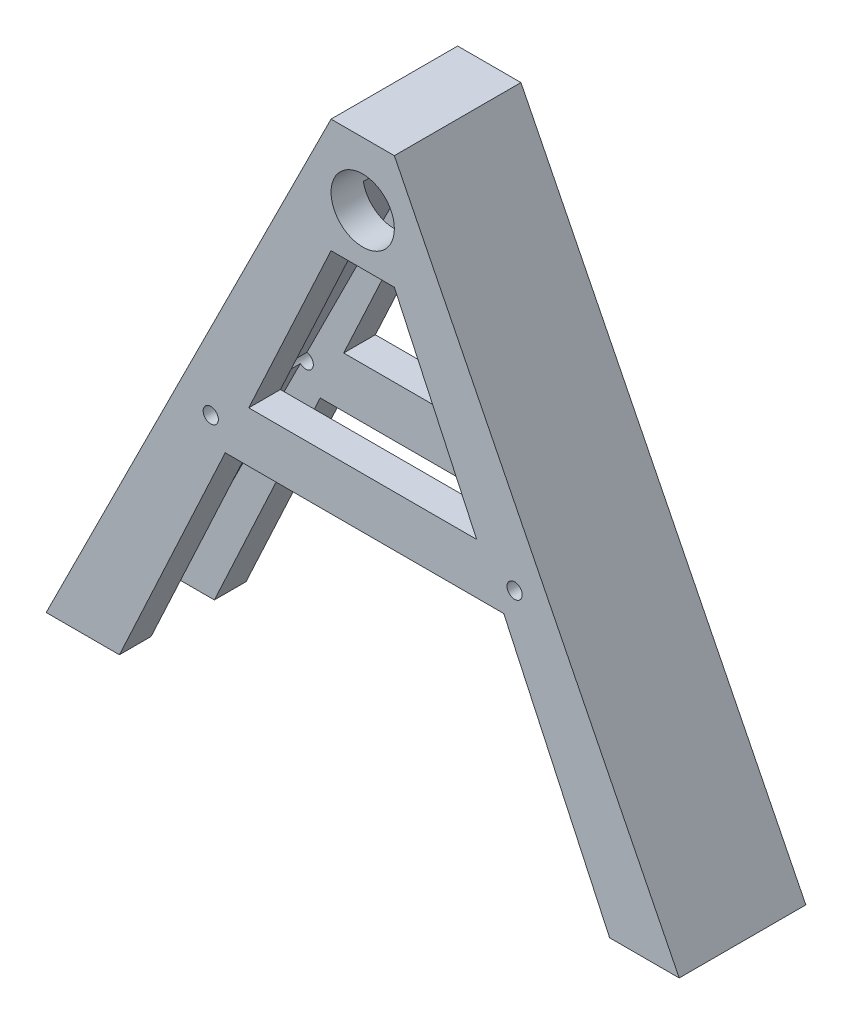
ISO-10303-21;
HEADER;
FILE_DESCRIPTION(('STEP AP214'),'2;1');
FILE_NAME('part.step','',(''),(''),'','','');
FILE_SCHEMA(('AUTOMOTIVE_DESIGN { 1 0 10303 214 1 1 1 1 }'));
ENDSEC;
DATA;
#1=APPLICATION_CONTEXT('core data for automotive mechanical design processes');
#2=APPLICATION_PROTOCOL_DEFINITION('international standard','automotive_design',2000,#1);
#3=PRODUCT_CONTEXT('',#1,'mechanical');
#4=PRODUCT('Part','Part','',(#3));
#5=PRODUCT_RELATED_PRODUCT_CATEGORY('part','',(#4));
#6=PRODUCT_DEFINITION_FORMATION('','',#4);
#7=PRODUCT_DEFINITION_CONTEXT('part definition',#1,'design');
#8=PRODUCT_DEFINITION('design','',#6,#7);
#9=PRODUCT_DEFINITION_SHAPE('','',#8);
#10=(LENGTH_UNIT() NAMED_UNIT(*) SI_UNIT(.MILLI.,.METRE.));
#11=(NAMED_UNIT(*) PLANE_ANGLE_UNIT() SI_UNIT($,.RADIAN.));
#12=(NAMED_UNIT(*) SI_UNIT($,.STERADIAN.) SOLID_ANGLE_UNIT());
#13=UNCERTAINTY_MEASURE_WITH_UNIT(LENGTH_MEASURE(1.E-05),#10,'distance_accuracy_value','');
#14=(GEOMETRIC_REPRESENTATION_CONTEXT(3) GLOBAL_UNCERTAINTY_ASSIGNED_CONTEXT((#13)) GLOBAL_UNIT_ASSIGNED_CONTEXT((#10,
#11,#12)) REPRESENTATION_CONTEXT('',''));
#15=CARTESIAN_POINT('',(0.,0.,0.));
#16=DIRECTION('',(0.,0.,1.));
#17=DIRECTION('',(1.,0.,0.));
#18=AXIS2_PLACEMENT_3D('',#15,#16,#17);
#19=CARTESIAN_POINT('',(-22.5601936685753,11.2800968342876,0.));
#20=DIRECTION('',(-0.894427190999916,0.447213595499958,0.));
#21=DIRECTION('',(-0.447213595499958,-0.894427190999916,0.));
#22=AXIS2_PLACEMENT_3D('',#19,#20,#21);
#23=PLANE('',#22);
#24=DIRECTION('',(-0.447213595499958,-0.894427190999916,0.));
#25=VECTOR('',#24,1.);
#26=CARTESIAN_POINT('',(-22.5601936685753,11.2800968342876,-3.175));
#27=LINE('',#26,#25);
#28=CARTESIAN_POINT('',(-15.7726819566402,24.8551202581578,-3.175));
#29=VERTEX_POINT('',#28);
#30=CARTESIAN_POINT('',(-28.2002420857191,0.,-3.175));
#31=VERTEX_POINT('',#30);
#32=EDGE_CURVE('E756',#29,#31,#27,.T.);
#33=ORIENTED_EDGE('',*,*,#32,.F.);
#34=DIRECTION('',(0.,0.,1.));
#35=VECTOR('',#34,1.);
#36=CARTESIAN_POINT('',(-15.7726819566402,24.8551202581578,-6.35005000000002));
#37=LINE('',#36,#35);
#38=CARTESIAN_POINT('',(-15.7726819566402,24.8551202581578,3.175));
#39=VERTEX_POINT('',#38);
#40=EDGE_CURVE('E652',#29,#39,#37,.T.);
#41=ORIENTED_EDGE('',*,*,#40,.T.);
#42=DIRECTION('',(-0.447213595499958,-0.894427190999916,0.));
#43=VECTOR('',#42,1.);
#44=CARTESIAN_POINT('',(-22.5601936685753,11.2800968342876,3.175));
#45=LINE('',#44,#43);
#46=CARTESIAN_POINT('',(-28.2002420857191,0.,3.175));
#47=VERTEX_POINT('',#46);
#48=EDGE_CURVE('E758',#39,#47,#45,.T.);
#49=ORIENTED_EDGE('',*,*,#48,.T.);
#50=DIRECTION('',(0.,0.,1.));
#51=VECTOR('',#50,1.);
#52=CARTESIAN_POINT('',(-28.2002420857191,0.,0.));
#53=LINE('',#52,#51);
#54=EDGE_CURVE('E767',#31,#47,#53,.T.);
#55=ORIENTED_EDGE('',*,*,#54,.F.);
#56=EDGE_LOOP('',(#33,#41,#49,#55));
#57=FACE_BOUND('',#56,.T.);
#58=ADVANCED_FACE('F49',(#57),#23,.F.);
#59=CARTESIAN_POINT('',(22.5601936685753,11.2800968342876,0.));
#60=DIRECTION('',(0.894427190999916,0.447213595499958,0.));
#61=DIRECTION('',(-0.447213595499958,0.894427190999916,0.));
#62=AXIS2_PLACEMENT_3D('',#59,#60,#61);
#63=PLANE('',#62);
#64=DIRECTION('',(0.447213595499958,-0.894427190999916,0.));
#65=VECTOR('',#64,1.);
#66=CARTESIAN_POINT('',(22.5601936685753,11.2800968342876,-3.175));
#67=LINE('',#66,#65);
#68=CARTESIAN_POINT('',(3.11283797287044,50.1748082256973,-3.175));
#69=VERTEX_POINT('',#68);
#70=CARTESIAN_POINT('',(15.1237053805104,26.1530734104174,-3.175));
#71=VERTEX_POINT('',#70);
#72=EDGE_CURVE('E291',#69,#71,#67,.T.);
#73=ORIENTED_EDGE('',*,*,#72,.T.);
#74=DIRECTION('',(0.,0.,1.));
#75=VECTOR('',#74,1.);
#76=CARTESIAN_POINT('',(15.1237053805104,26.1530734104174,-6.35005000000002));
#77=LINE('',#76,#75);
#78=CARTESIAN_POINT('',(15.1237053805104,26.1530734104174,3.175));
#79=VERTEX_POINT('',#78);
#80=EDGE_CURVE('E58',#71,#79,#77,.T.);
#81=ORIENTED_EDGE('',*,*,#80,.T.);
#82=DIRECTION('',(0.447213595499958,-0.894427190999916,0.));
#83=VECTOR('',#82,1.);
#84=CARTESIAN_POINT('',(22.5601936685753,11.2800968342876,3.175));
#85=LINE('',#84,#83);
#86=CARTESIAN_POINT('',(3.11283797287045,50.1748082256973,3.175));
#87=VERTEX_POINT('',#86);
#88=EDGE_CURVE('E280',#87,#79,#85,.T.);
#89=ORIENTED_EDGE('',*,*,#88,.F.);
#90=DIRECTION('',(0.,0.,1.));
#91=VECTOR('',#90,1.);
#92=CARTESIAN_POINT('',(3.11283797287045,50.1748082256973,-6.35005000000002));
#93=LINE('',#92,#91);
#94=EDGE_CURVE('E497',#87,#69,#93,.F.);
#95=ORIENTED_EDGE('',*,*,#94,.T.);
#96=EDGE_LOOP('',(#73,#81,#89,#95));
#97=FACE_BOUND('',#96,.T.);
#98=ADVANCED_FACE('F636',(#97),#63,.F.);
#99=CARTESIAN_POINT('',(-3.11283797287045,50.1748082256973,3.175));
#100=VERTEX_POINT('',#99);
#101=CARTESIAN_POINT('',(-15.1237053805104,26.1530734104174,3.175));
#102=VERTEX_POINT('',#101);
#103=EDGE_CURVE('E632',#100,#102,#45,.T.);
#104=ORIENTED_EDGE('',*,*,#103,.T.);
#105=DIRECTION('',(0.,0.,1.));
#106=VECTOR('',#105,1.);
#107=CARTESIAN_POINT('',(-15.1237053805104,26.1530734104174,-6.35005000000002));
#108=LINE('',#107,#106);
#109=CARTESIAN_POINT('',(-15.1237053805104,26.1530734104174,-3.175));
#110=VERTEX_POINT('',#109);
#111=EDGE_CURVE('E65',#102,#110,#108,.F.);
#112=ORIENTED_EDGE('',*,*,#111,.T.);
#113=CARTESIAN_POINT('',(-3.11283797287045,50.1748082256973,-3.175));
#114=VERTEX_POINT('',#113);
#115=EDGE_CURVE('E759',#114,#110,#27,.T.);
#116=ORIENTED_EDGE('',*,*,#115,.F.);
#117=DIRECTION('',(0.,0.,1.));
#118=VECTOR('',#117,1.);
#119=CARTESIAN_POINT('',(-3.11283797287045,50.1748082256973,-6.35005000000002));
#120=LINE('',#119,#118);
#121=EDGE_CURVE('E608',#114,#100,#120,.T.);
#122=ORIENTED_EDGE('',*,*,#121,.T.);
#123=EDGE_LOOP('',(#104,#112,#116,#122));
#124=FACE_BOUND('',#123,.T.);
#125=ADVANCED_FACE('F790',(#124),#23,.F.);
#126=CARTESIAN_POINT('',(0.,0.,-3.175));
#127=DIRECTION('',(0.,0.,-1.));
#128=DIRECTION('',(0.,1.,0.));
#129=AXIS2_PLACEMENT_3D('',#126,#127,#128);
#130=PLANE('',#129);
#131=DIRECTION('',(0.421111306454629,0.907008967748432,0.));
#132=VECTOR('',#131,1.);
#133=CARTESIAN_POINT('',(-20.074795383001,9.3204407135362,-3.175));
#134=LINE('',#133,#132);
#135=CARTESIAN_POINT('',(-11.43,27.94,-3.175));
#136=VERTEX_POINT('',#135);
#137=CARTESIAN_POINT('',(-3.175,45.72,-3.175));
#138=VERTEX_POINT('',#137);
#139=EDGE_CURVE('E486',#136,#138,#134,.T.);
#140=ORIENTED_EDGE('',*,*,#139,.T.);
#141=DIRECTION('',(1.,0.,0.));
#142=VECTOR('',#141,1.);
#143=CARTESIAN_POINT('',(0.,45.72,-3.175));
#144=LINE('',#143,#142);
#145=CARTESIAN_POINT('',(3.175,45.72,-3.175));
#146=VERTEX_POINT('',#145);
#147=EDGE_CURVE('E495',#138,#146,#144,.T.);
#148=ORIENTED_EDGE('',*,*,#147,.T.);
#149=DIRECTION('',(0.421111306454629,-0.907008967748432,0.));
#150=VECTOR('',#149,1.);
#151=CARTESIAN_POINT('',(20.074795383001,9.3204407135362,-3.175));
#152=LINE('',#151,#150);
#153=CARTESIAN_POINT('',(11.43,27.94,-3.175));
#154=VERTEX_POINT('',#153);
#155=EDGE_CURVE('E492',#146,#154,#152,.T.);
#156=ORIENTED_EDGE('',*,*,#155,.T.);
#157=DIRECTION('',(-1.,0.,0.));
#158=VECTOR('',#157,1.);
#159=CARTESIAN_POINT('',(0.,27.94,-3.175));
#160=LINE('',#159,#158);
#161=EDGE_CURVE('E489',#154,#136,#160,.T.);
#162=ORIENTED_EDGE('',*,*,#161,.T.);
#163=EDGE_LOOP('',(#140,#148,#156,#162));
#164=FACE_BOUND('',#163,.T.);
#165=ORIENTED_EDGE('',*,*,#115,.T.);
#166=CARTESIAN_POINT('',(-15.24,25.4,-3.175));
#167=DIRECTION('',(0.,0.,-1.));
#168=DIRECTION('',(0.,1.,0.));
#169=AXIS2_PLACEMENT_3D('',#166,#167,#168);
#170=CIRCLE('',#169,0.762000000000001);
#171=EDGE_CURVE('E655',#110,#29,#170,.T.);
#172=ORIENTED_EDGE('',*,*,#171,.T.);
#173=ORIENTED_EDGE('',*,*,#32,.T.);
#174=DIRECTION('',(-1.,0.,0.));
#175=VECTOR('',#174,1.);
#176=CARTESIAN_POINT('',(0.,0.,-3.175));
#177=LINE('',#176,#175);
#178=CARTESIAN_POINT('',(-24.4021428571429,0.,-3.175));
#179=VERTEX_POINT('',#178);
#180=EDGE_CURVE('E299',#179,#31,#177,.T.);
#181=ORIENTED_EDGE('',*,*,#180,.F.);
#182=DIRECTION('',(0.421111306454629,0.907008967748432,0.));
#183=VECTOR('',#182,1.);
#184=CARTESIAN_POINT('',(-20.074795383001,9.3204407135362,-3.175));
#185=LINE('',#184,#183);
#186=CARTESIAN_POINT('',(-13.7885714285714,22.86,-3.175));
#187=VERTEX_POINT('',#186);
#188=EDGE_CURVE('E450',#179,#187,#185,.T.);
#189=ORIENTED_EDGE('',*,*,#188,.T.);
#190=DIRECTION('',(1.,0.,0.));
#191=VECTOR('',#190,1.);
#192=CARTESIAN_POINT('',(0.,22.86,-3.175));
#193=LINE('',#192,#191);
#194=CARTESIAN_POINT('',(14.1514285714286,22.86,-3.175));
#195=VERTEX_POINT('',#194);
#196=EDGE_CURVE('E480',#187,#195,#193,.T.);
#197=ORIENTED_EDGE('',*,*,#196,.T.);
#198=DIRECTION('',(0.421111306454629,-0.907008967748432,0.));
#199=VECTOR('',#198,1.);
#200=CARTESIAN_POINT('',(20.3733053515215,9.45903462749212,-3.175));
#201=LINE('',#200,#199);
#202=CARTESIAN_POINT('',(24.765,0.,-3.175));
#203=VERTEX_POINT('',#202);
#204=EDGE_CURVE('E483',#195,#203,#201,.T.);
#205=ORIENTED_EDGE('',*,*,#204,.T.);
#206=CARTESIAN_POINT('',(28.2002420857191,0.,-3.175));
#207=VERTEX_POINT('',#206);
#208=EDGE_CURVE('E304',#207,#203,#177,.T.);
#209=ORIENTED_EDGE('',*,*,#208,.F.);
#210=CARTESIAN_POINT('',(15.7726819566402,24.8551202581578,-3.175));
#211=VERTEX_POINT('',#210);
#212=EDGE_CURVE('E293',#211,#207,#67,.T.);
#213=ORIENTED_EDGE('',*,*,#212,.F.);
#214=CARTESIAN_POINT('',(15.24,25.4,-3.175));
#215=DIRECTION('',(0.,0.,-1.));
#216=DIRECTION('',(0.,1.,0.));
#217=AXIS2_PLACEMENT_3D('',#214,#215,#216);
#218=CIRCLE('',#217,0.762000000000001);
#219=EDGE_CURVE('E72',#211,#71,#218,.T.);
#220=ORIENTED_EDGE('',*,*,#219,.T.);
#221=ORIENTED_EDGE('',*,*,#72,.F.);
#222=CARTESIAN_POINT('',(0.,50.8,-3.175));
#223=DIRECTION('',(0.,0.,-1.));
#224=DIRECTION('',(0.,1.,0.));
#225=AXIS2_PLACEMENT_3D('',#222,#223,#224);
#226=CIRCLE('',#225,3.175);
#227=EDGE_CURVE('E610',#69,#114,#226,.T.);
#228=ORIENTED_EDGE('',*,*,#227,.T.);
#229=EDGE_LOOP('',(#165,#172,#173,#181,#189,#197,#205,#209,#213,#220,#221,#228));
#230=FACE_BOUND('',#229,.T.);
#231=ADVANCED_FACE('F643',(#164,#230),#130,.F.);
#232=CARTESIAN_POINT('',(0.,0.,0.));
#233=DIRECTION('',(0.,-1.,0.));
#234=DIRECTION('',(0.,0.,-1.));
#235=AXIS2_PLACEMENT_3D('',#232,#233,#234);
#236=PLANE('',#235);
#237=DIRECTION('',(0.,0.,1.));
#238=VECTOR('',#237,1.);
#239=CARTESIAN_POINT('',(24.765,0.,-6.35005));
#240=LINE('',#239,#238);
#241=CARTESIAN_POINT('',(24.765,0.,-6.35));
#242=VERTEX_POINT('',#241);
#243=EDGE_CURVE('E701',#242,#203,#240,.T.);
#244=ORIENTED_EDGE('',*,*,#243,.F.);
#245=DIRECTION('',(-1.,0.,0.));
#246=VECTOR('',#245,1.);
#247=CARTESIAN_POINT('',(-31.75,0.,-6.35));
#248=LINE('',#247,#246);
#249=CARTESIAN_POINT('',(31.75,0.,-6.35));
#250=VERTEX_POINT('',#249);
#251=EDGE_CURVE('E393',#250,#242,#248,.T.);
#252=ORIENTED_EDGE('',*,*,#251,.F.);
#253=DIRECTION('',(0.,0.,-1.));
#254=VECTOR('',#253,1.);
#255=CARTESIAN_POINT('',(31.75,0.,6.35));
#256=LINE('',#255,#254);
#257=CARTESIAN_POINT('',(31.75,0.,6.35));
#258=VERTEX_POINT('',#257);
#259=EDGE_CURVE('E452',#258,#250,#256,.T.);
#260=ORIENTED_EDGE('',*,*,#259,.F.);
#261=DIRECTION('',(1.,0.,0.));
#262=VECTOR('',#261,1.);
#263=CARTESIAN_POINT('',(-31.75,0.,6.35));
#264=LINE('',#263,#262);
#265=CARTESIAN_POINT('',(24.765,0.,6.35));
#266=VERTEX_POINT('',#265);
#267=EDGE_CURVE('E363',#266,#258,#264,.T.);
#268=ORIENTED_EDGE('',*,*,#267,.F.);
#269=CARTESIAN_POINT('',(24.765,0.,3.175));
#270=VERTEX_POINT('',#269);
#271=EDGE_CURVE('E709',#270,#266,#240,.T.);
#272=ORIENTED_EDGE('',*,*,#271,.F.);
#273=DIRECTION('',(1.,0.,0.));
#274=VECTOR('',#273,1.);
#275=CARTESIAN_POINT('',(0.,0.,3.175));
#276=LINE('',#275,#274);
#277=CARTESIAN_POINT('',(28.2002420857191,0.,3.175));
#278=VERTEX_POINT('',#277);
#279=EDGE_CURVE('E312',#270,#278,#276,.T.);
#280=ORIENTED_EDGE('',*,*,#279,.T.);
#281=DIRECTION('',(0.,0.,-1.));
#282=VECTOR('',#281,1.);
#283=CARTESIAN_POINT('',(28.2002420857191,0.,0.));
#284=LINE('',#283,#282);
#285=EDGE_CURVE('E286',#278,#207,#284,.T.);
#286=ORIENTED_EDGE('',*,*,#285,.T.);
#287=ORIENTED_EDGE('',*,*,#208,.T.);
#288=EDGE_LOOP('',(#244,#252,#260,#268,#272,#280,#286,#287));
#289=FACE_BOUND('',#288,.T.);
#290=ADVANCED_FACE('F773',(#289),#236,.T.);
#291=DIRECTION('',(0.,0.,1.));
#292=VECTOR('',#291,1.);
#293=CARTESIAN_POINT('',(-24.4021428571429,0.,-6.35005));
#294=LINE('',#293,#292);
#295=CARTESIAN_POINT('',(-24.4021428571429,0.,3.175));
#296=VERTEX_POINT('',#295);
#297=CARTESIAN_POINT('',(-24.4021428571429,0.,6.35));
#298=VERTEX_POINT('',#297);
#299=EDGE_CURVE('E849',#296,#298,#294,.T.);
#300=ORIENTED_EDGE('',*,*,#299,.T.);
#301=CARTESIAN_POINT('',(-31.75,0.,6.35));
#302=VERTEX_POINT('',#301);
#303=EDGE_CURVE('E448',#302,#298,#264,.T.);
#304=ORIENTED_EDGE('',*,*,#303,.F.);
#305=DIRECTION('',(0.,0.,1.));
#306=VECTOR('',#305,1.);
#307=CARTESIAN_POINT('',(-31.75,0.,6.35));
#308=LINE('',#307,#306);
#309=CARTESIAN_POINT('',(-31.75,0.,-6.35));
#310=VERTEX_POINT('',#309);
#311=EDGE_CURVE('E390',#310,#302,#308,.T.);
#312=ORIENTED_EDGE('',*,*,#311,.F.);
#313=CARTESIAN_POINT('',(-24.4021428571429,0.,-6.35));
#314=VERTEX_POINT('',#313);
#315=EDGE_CURVE('E394',#314,#310,#248,.T.);
#316=ORIENTED_EDGE('',*,*,#315,.F.);
#317=EDGE_CURVE('E711',#314,#179,#294,.T.);
#318=ORIENTED_EDGE('',*,*,#317,.T.);
#319=ORIENTED_EDGE('',*,*,#180,.T.);
#320=ORIENTED_EDGE('',*,*,#54,.T.);
#321=EDGE_CURVE('E308',#47,#296,#276,.T.);
#322=ORIENTED_EDGE('',*,*,#321,.T.);
#323=EDGE_LOOP('',(#300,#304,#312,#316,#318,#319,#320,#322));
#324=FACE_BOUND('',#323,.T.);
#325=ADVANCED_FACE('F51',(#324),#236,.T.);
#326=CARTESIAN_POINT('',(0.,57.15,0.));
#327=DIRECTION('',(0.,-1.,0.));
#328=DIRECTION('',(0.,0.,-1.));
#329=AXIS2_PLACEMENT_3D('',#326,#327,#328);
#330=PLANE('',#329);
#331=DIRECTION('',(0.,0.,-1.));
#332=VECTOR('',#331,1.);
#333=CARTESIAN_POINT('',(3.175,57.15,6.35));
#334=LINE('',#333,#332);
#335=CARTESIAN_POINT('',(3.175,57.15,6.35));
#336=VERTEX_POINT('',#335);
#337=CARTESIAN_POINT('',(3.175,57.15,-6.35));
#338=VERTEX_POINT('',#337);
#339=EDGE_CURVE('E311',#336,#338,#334,.T.);
#340=ORIENTED_EDGE('',*,*,#339,.T.);
#341=DIRECTION('',(-1.,0.,0.));
#342=VECTOR('',#341,1.);
#343=CARTESIAN_POINT('',(-3.175,57.15,-6.35));
#344=LINE('',#343,#342);
#345=CARTESIAN_POINT('',(-3.175,57.15,-6.35));
#346=VERTEX_POINT('',#345);
#347=EDGE_CURVE('E397',#338,#346,#344,.T.);
#348=ORIENTED_EDGE('',*,*,#347,.T.);
#349=DIRECTION('',(0.,0.,1.));
#350=VECTOR('',#349,1.);
#351=CARTESIAN_POINT('',(-3.175,57.15,6.35));
#352=LINE('',#351,#350);
#353=CARTESIAN_POINT('',(-3.175,57.15,6.35));
#354=VERTEX_POINT('',#353);
#355=EDGE_CURVE('E401',#346,#354,#352,.T.);
#356=ORIENTED_EDGE('',*,*,#355,.T.);
#357=DIRECTION('',(1.,0.,0.));
#358=VECTOR('',#357,1.);
#359=CARTESIAN_POINT('',(-3.175,57.15,6.35));
#360=LINE('',#359,#358);
#361=EDGE_CURVE('E318',#354,#336,#360,.T.);
#362=ORIENTED_EDGE('',*,*,#361,.T.);
#363=EDGE_LOOP('',(#340,#348,#356,#362));
#364=FACE_BOUND('',#363,.T.);
#365=ADVANCED_FACE('F417',(#364),#330,.F.);
#366=CARTESIAN_POINT('',(-25.4,12.7,0.));
#367=DIRECTION('',(-0.894427190999916,0.447213595499958,0.));
#368=DIRECTION('',(-0.447213595499958,-0.894427190999916,0.));
#369=AXIS2_PLACEMENT_3D('',#366,#367,#368);
#370=PLANE('',#369);
#371=DIRECTION('',(-0.447213595499958,-0.894427190999916,0.));
#372=VECTOR('',#371,1.);
#373=CARTESIAN_POINT('',(-3.175,57.15,-6.35));
#374=LINE('',#373,#372);
#375=EDGE_CURVE('E556',#346,#310,#374,.T.);
#376=ORIENTED_EDGE('',*,*,#375,.T.);
#377=ORIENTED_EDGE('',*,*,#311,.T.);
#378=DIRECTION('',(-0.447213595499958,-0.894427190999916,0.));
#379=VECTOR('',#378,1.);
#380=CARTESIAN_POINT('',(-3.175,57.15,6.35));
#381=LINE('',#380,#379);
#382=EDGE_CURVE('E324',#354,#302,#381,.T.);
#383=ORIENTED_EDGE('',*,*,#382,.F.);
#384=ORIENTED_EDGE('',*,*,#355,.F.);
#385=EDGE_LOOP('',(#376,#377,#383,#384));
#386=FACE_BOUND('',#385,.T.);
#387=ADVANCED_FACE('F337',(#386),#370,.T.);
#388=CARTESIAN_POINT('',(0.,0.,6.35));
#389=DIRECTION('',(0.,0.,1.));
#390=DIRECTION('',(0.,-1.,0.));
#391=AXIS2_PLACEMENT_3D('',#388,#389,#390);
#392=PLANE('',#391);
#393=CARTESIAN_POINT('',(-15.24,25.4,6.35));
#394=DIRECTION('',(0.,0.,1.));
#395=DIRECTION('',(1.,0.,0.));
#396=AXIS2_PLACEMENT_3D('',#393,#394,#395);
#397=CIRCLE('',#396,0.762000000000001);
#398=CARTESIAN_POINT('',(-14.478,25.4,6.35));
#399=VERTEX_POINT('',#398);
#400=EDGE_CURVE('E281',#399,#399,#397,.T.);
#401=ORIENTED_EDGE('',*,*,#400,.F.);
#402=EDGE_LOOP('',(#401));
#403=FACE_BOUND('',#402,.T.);
#404=CARTESIAN_POINT('',(15.24,25.4,6.35));
#405=DIRECTION('',(0.,0.,1.));
#406=DIRECTION('',(-1.,0.,0.));
#407=AXIS2_PLACEMENT_3D('',#404,#405,#406);
#408=CIRCLE('',#407,0.762000000000001);
#409=CARTESIAN_POINT('',(14.478,25.4,6.35));
#410=VERTEX_POINT('',#409);
#411=EDGE_CURVE('E1146',#410,#410,#408,.T.);
#412=ORIENTED_EDGE('',*,*,#411,.F.);
#413=EDGE_LOOP('',(#412));
#414=FACE_BOUND('',#413,.T.);
#415=CARTESIAN_POINT('',(0.,50.8,6.35));
#416=DIRECTION('',(0.,0.,1.));
#417=DIRECTION('',(1.,0.,0.));
#418=AXIS2_PLACEMENT_3D('',#415,#416,#417);
#419=CIRCLE('',#418,3.175);
#420=CARTESIAN_POINT('',(3.175,50.8,6.35));
#421=VERTEX_POINT('',#420);
#422=EDGE_CURVE('E619',#421,#421,#419,.T.);
#423=ORIENTED_EDGE('',*,*,#422,.F.);
#424=EDGE_LOOP('',(#423));
#425=FACE_BOUND('',#424,.T.);
#426=DIRECTION('',(-1.,0.,0.));
#427=VECTOR('',#426,1.);
#428=CARTESIAN_POINT('',(-3.175,45.72,6.35));
#429=LINE('',#428,#427);
#430=CARTESIAN_POINT('',(3.175,45.72,6.35));
#431=VERTEX_POINT('',#430);
#432=CARTESIAN_POINT('',(-3.175,45.72,6.35));
#433=VERTEX_POINT('',#432);
#434=EDGE_CURVE('E668',#431,#433,#429,.T.);
#435=ORIENTED_EDGE('',*,*,#434,.F.);
#436=DIRECTION('',(-0.421111306454629,0.907008967748432,0.));
#437=VECTOR('',#436,1.);
#438=CARTESIAN_POINT('',(3.175,45.72,6.35));
#439=LINE('',#438,#437);
#440=CARTESIAN_POINT('',(11.43,27.94,6.35));
#441=VERTEX_POINT('',#440);
#442=EDGE_CURVE('E671',#441,#431,#439,.T.);
#443=ORIENTED_EDGE('',*,*,#442,.F.);
#444=DIRECTION('',(1.,0.,0.));
#445=VECTOR('',#444,1.);
#446=CARTESIAN_POINT('',(11.43,27.94,6.35));
#447=LINE('',#446,#445);
#448=CARTESIAN_POINT('',(-11.43,27.94,6.35));
#449=VERTEX_POINT('',#448);
#450=EDGE_CURVE('E679',#449,#441,#447,.T.);
#451=ORIENTED_EDGE('',*,*,#450,.F.);
#452=DIRECTION('',(-0.421111306454629,-0.907008967748432,0.));
#453=VECTOR('',#452,1.);
#454=CARTESIAN_POINT('',(-11.43,27.94,6.35));
#455=LINE('',#454,#453);
#456=EDGE_CURVE('E673',#433,#449,#455,.T.);
#457=ORIENTED_EDGE('',*,*,#456,.F.);
#458=EDGE_LOOP('',(#435,#443,#451,#457));
#459=FACE_BOUND('',#458,.T.);
#460=DIRECTION('',(-0.421111306454629,0.907008967748432,0.));
#461=VECTOR('',#460,1.);
#462=CARTESIAN_POINT('',(14.1514285714286,22.86,6.35));
#463=LINE('',#462,#461);
#464=CARTESIAN_POINT('',(14.1514285714286,22.86,6.35));
#465=VERTEX_POINT('',#464);
#466=EDGE_CURVE('E372',#266,#465,#463,.T.);
#467=ORIENTED_EDGE('',*,*,#466,.F.);
#468=ORIENTED_EDGE('',*,*,#267,.T.);
#469=DIRECTION('',(0.447213595499958,-0.894427190999916,0.));
#470=VECTOR('',#469,1.);
#471=CARTESIAN_POINT('',(3.175,57.15,6.35));
#472=LINE('',#471,#470);
#473=EDGE_CURVE('E544',#336,#258,#472,.T.);
#474=ORIENTED_EDGE('',*,*,#473,.F.);
#475=ORIENTED_EDGE('',*,*,#361,.F.);
#476=ORIENTED_EDGE('',*,*,#382,.T.);
#477=ORIENTED_EDGE('',*,*,#303,.T.);
#478=DIRECTION('',(-0.421111306454629,-0.907008967748432,0.));
#479=VECTOR('',#478,1.);
#480=CARTESIAN_POINT('',(-24.4021428571429,0.,6.35));
#481=LINE('',#480,#479);
#482=CARTESIAN_POINT('',(-13.7885714285714,22.86,6.35));
#483=VERTEX_POINT('',#482);
#484=EDGE_CURVE('E580',#483,#298,#481,.T.);
#485=ORIENTED_EDGE('',*,*,#484,.F.);
#486=DIRECTION('',(-1.,0.,0.));
#487=VECTOR('',#486,1.);
#488=CARTESIAN_POINT('',(-13.7885714285714,22.86,6.35));
#489=LINE('',#488,#487);
#490=EDGE_CURVE('E576',#465,#483,#489,.T.);
#491=ORIENTED_EDGE('',*,*,#490,.F.);
#492=EDGE_LOOP('',(#467,#468,#474,#475,#476,#477,#485,#491));
#493=FACE_BOUND('',#492,.T.);
#494=ADVANCED_FACE('F326',(#403,#414,#425,#459,#493),#392,.T.);
#495=CARTESIAN_POINT('',(0.,0.,-6.35));
#496=DIRECTION('',(0.,0.,-1.));
#497=DIRECTION('',(0.,1.,0.));
#498=AXIS2_PLACEMENT_3D('',#495,#496,#497);
#499=PLANE('',#498);
#500=CARTESIAN_POINT('',(-15.24,25.4,-6.35));
#501=DIRECTION('',(0.,0.,-1.));
#502=DIRECTION('',(0.,1.,0.));
#503=AXIS2_PLACEMENT_3D('',#500,#501,#502);
#504=CIRCLE('',#503,0.762000000000001);
#505=CARTESIAN_POINT('',(-15.24,26.162,-6.35));
#506=VERTEX_POINT('',#505);
#507=EDGE_CURVE('E658',#506,#506,#504,.T.);
#508=ORIENTED_EDGE('',*,*,#507,.F.);
#509=EDGE_LOOP('',(#508));
#510=FACE_BOUND('',#509,.T.);
#511=CARTESIAN_POINT('',(15.24,25.4,-6.35));
#512=DIRECTION('',(0.,0.,-1.));
#513=DIRECTION('',(0.,1.,0.));
#514=AXIS2_PLACEMENT_3D('',#511,#512,#513);
#515=CIRCLE('',#514,0.762000000000001);
#516=CARTESIAN_POINT('',(15.24,26.162,-6.35));
#517=VERTEX_POINT('',#516);
#518=EDGE_CURVE('E645',#517,#517,#515,.T.);
#519=ORIENTED_EDGE('',*,*,#518,.F.);
#520=EDGE_LOOP('',(#519));
#521=FACE_BOUND('',#520,.T.);
#522=CARTESIAN_POINT('',(0.,50.8,-6.35));
#523=DIRECTION('',(0.,0.,-1.));
#524=DIRECTION('',(0.,1.,0.));
#525=AXIS2_PLACEMENT_3D('',#522,#523,#524);
#526=CIRCLE('',#525,3.175);
#527=CARTESIAN_POINT('',(0.,53.975,-6.35));
#528=VERTEX_POINT('',#527);
#529=EDGE_CURVE('E586',#528,#528,#526,.T.);
#530=ORIENTED_EDGE('',*,*,#529,.F.);
#531=EDGE_LOOP('',(#530));
#532=FACE_BOUND('',#531,.T.);
#533=DIRECTION('',(1.,0.,0.));
#534=VECTOR('',#533,1.);
#535=CARTESIAN_POINT('',(0.,45.72,-6.35));
#536=LINE('',#535,#534);
#537=CARTESIAN_POINT('',(-3.175,45.72,-6.35));
#538=VERTEX_POINT('',#537);
#539=CARTESIAN_POINT('',(3.175,45.72,-6.35));
#540=VERTEX_POINT('',#539);
#541=EDGE_CURVE('E744',#538,#540,#536,.T.);
#542=ORIENTED_EDGE('',*,*,#541,.F.);
#543=DIRECTION('',(0.421111306454629,0.907008967748432,0.));
#544=VECTOR('',#543,1.);
#545=CARTESIAN_POINT('',(-20.074795383001,9.3204407135362,-6.35));
#546=LINE('',#545,#544);
#547=CARTESIAN_POINT('',(-11.43,27.94,-6.35));
#548=VERTEX_POINT('',#547);
#549=EDGE_CURVE('E728',#548,#538,#546,.T.);
#550=ORIENTED_EDGE('',*,*,#549,.F.);
#551=DIRECTION('',(-1.,0.,0.));
#552=VECTOR('',#551,1.);
#553=CARTESIAN_POINT('',(0.,27.94,-6.35));
#554=LINE('',#553,#552);
#555=CARTESIAN_POINT('',(11.43,27.94,-6.35));
#556=VERTEX_POINT('',#555);
#557=EDGE_CURVE('E733',#556,#548,#554,.T.);
#558=ORIENTED_EDGE('',*,*,#557,.F.);
#559=DIRECTION('',(0.421111306454629,-0.907008967748432,0.));
#560=VECTOR('',#559,1.);
#561=CARTESIAN_POINT('',(20.074795383001,9.3204407135362,-6.35));
#562=LINE('',#561,#560);
#563=EDGE_CURVE('E739',#540,#556,#562,.T.);
#564=ORIENTED_EDGE('',*,*,#563,.F.);
#565=EDGE_LOOP('',(#542,#550,#558,#564));
#566=FACE_BOUND('',#565,.T.);
#567=DIRECTION('',(0.421111306454629,-0.907008967748432,0.));
#568=VECTOR('',#567,1.);
#569=CARTESIAN_POINT('',(20.3733053515215,9.45903462749212,-6.35));
#570=LINE('',#569,#568);
#571=CARTESIAN_POINT('',(14.1514285714286,22.86,-6.35));
#572=VERTEX_POINT('',#571);
#573=EDGE_CURVE('E715',#572,#242,#570,.T.);
#574=ORIENTED_EDGE('',*,*,#573,.F.);
#575=DIRECTION('',(1.,0.,0.));
#576=VECTOR('',#575,1.);
#577=CARTESIAN_POINT('',(0.,22.86,-6.35));
#578=LINE('',#577,#576);
#579=CARTESIAN_POINT('',(-13.7885714285714,22.86,-6.35));
#580=VERTEX_POINT('',#579);
#581=EDGE_CURVE('E723',#580,#572,#578,.T.);
#582=ORIENTED_EDGE('',*,*,#581,.F.);
#583=DIRECTION('',(0.421111306454629,0.907008967748432,0.));
#584=VECTOR('',#583,1.);
#585=CARTESIAN_POINT('',(-20.074795383001,9.3204407135362,-6.35));
#586=LINE('',#585,#584);
#587=EDGE_CURVE('E716',#314,#580,#586,.T.);
#588=ORIENTED_EDGE('',*,*,#587,.F.);
#589=ORIENTED_EDGE('',*,*,#315,.T.);
#590=ORIENTED_EDGE('',*,*,#375,.F.);
#591=ORIENTED_EDGE('',*,*,#347,.F.);
#592=DIRECTION('',(0.447213595499958,-0.894427190999916,0.));
#593=VECTOR('',#592,1.);
#594=CARTESIAN_POINT('',(3.175,57.15,-6.35));
#595=LINE('',#594,#593);
#596=EDGE_CURVE('E542',#338,#250,#595,.T.);
#597=ORIENTED_EDGE('',*,*,#596,.T.);
#598=ORIENTED_EDGE('',*,*,#251,.T.);
#599=EDGE_LOOP('',(#574,#582,#588,#589,#590,#591,#597,#598));
#600=FACE_BOUND('',#599,.T.);
#601=ADVANCED_FACE('F336',(#510,#521,#532,#566,#600),#499,.T.);
#602=CARTESIAN_POINT('',(25.4,12.7,0.));
#603=DIRECTION('',(0.894427190999916,0.447213595499958,0.));
#604=DIRECTION('',(-0.447213595499958,0.894427190999916,0.));
#605=AXIS2_PLACEMENT_3D('',#602,#603,#604);
#606=PLANE('',#605);
#607=ORIENTED_EDGE('',*,*,#473,.T.);
#608=ORIENTED_EDGE('',*,*,#259,.T.);
#609=ORIENTED_EDGE('',*,*,#596,.F.);
#610=ORIENTED_EDGE('',*,*,#339,.F.);
#611=EDGE_LOOP('',(#607,#608,#609,#610));
#612=FACE_BOUND('',#611,.T.);
#613=ADVANCED_FACE('F521',(#612),#606,.T.);
#614=CARTESIAN_POINT('',(0.,0.,3.175));
#615=DIRECTION('',(0.,0.,1.));
#616=DIRECTION('',(0.,-1.,0.));
#617=AXIS2_PLACEMENT_3D('',#614,#615,#616);
#618=PLANE('',#617);
#619=DIRECTION('',(-0.421111306454629,0.907008967748432,0.));
#620=VECTOR('',#619,1.);
#621=CARTESIAN_POINT('',(20.074795383001,9.3204407135362,3.175));
#622=LINE('',#621,#620);
#623=CARTESIAN_POINT('',(11.43,27.94,3.175));
#624=VERTEX_POINT('',#623);
#625=CARTESIAN_POINT('',(3.175,45.72,3.175));
#626=VERTEX_POINT('',#625);
#627=EDGE_CURVE('E736',#624,#626,#622,.T.);
#628=ORIENTED_EDGE('',*,*,#627,.T.);
#629=DIRECTION('',(-1.,0.,0.));
#630=VECTOR('',#629,1.);
#631=CARTESIAN_POINT('',(0.,45.72,3.175));
#632=LINE('',#631,#630);
#633=CARTESIAN_POINT('',(-3.175,45.72,3.175));
#634=VERTEX_POINT('',#633);
#635=EDGE_CURVE('E741',#626,#634,#632,.T.);
#636=ORIENTED_EDGE('',*,*,#635,.T.);
#637=DIRECTION('',(-0.421111306454629,-0.907008967748432,0.));
#638=VECTOR('',#637,1.);
#639=CARTESIAN_POINT('',(-20.074795383001,9.3204407135362,3.175));
#640=LINE('',#639,#638);
#641=CARTESIAN_POINT('',(-11.43,27.94,3.175));
#642=VERTEX_POINT('',#641);
#643=EDGE_CURVE('E725',#634,#642,#640,.T.);
#644=ORIENTED_EDGE('',*,*,#643,.T.);
#645=DIRECTION('',(1.,0.,0.));
#646=VECTOR('',#645,1.);
#647=CARTESIAN_POINT('',(0.,27.94,3.175));
#648=LINE('',#647,#646);
#649=EDGE_CURVE('E730',#642,#624,#648,.T.);
#650=ORIENTED_EDGE('',*,*,#649,.T.);
#651=EDGE_LOOP('',(#628,#636,#644,#650));
#652=FACE_BOUND('',#651,.T.);
#653=ORIENTED_EDGE('',*,*,#48,.F.);
#654=CARTESIAN_POINT('',(-15.24,25.4,3.175));
#655=DIRECTION('',(0.,0.,1.));
#656=DIRECTION('',(0.,-1.,0.));
#657=AXIS2_PLACEMENT_3D('',#654,#655,#656);
#658=CIRCLE('',#657,0.762000000000001);
#659=EDGE_CURVE('E12',#39,#102,#658,.T.);
#660=ORIENTED_EDGE('',*,*,#659,.T.);
#661=ORIENTED_EDGE('',*,*,#103,.F.);
#662=CARTESIAN_POINT('',(0.,50.8,3.175));
#663=DIRECTION('',(0.,0.,1.));
#664=DIRECTION('',(0.,-1.,0.));
#665=AXIS2_PLACEMENT_3D('',#662,#663,#664);
#666=CIRCLE('',#665,3.175);
#667=EDGE_CURVE('E613',#100,#87,#666,.T.);
#668=ORIENTED_EDGE('',*,*,#667,.T.);
#669=ORIENTED_EDGE('',*,*,#88,.T.);
#670=CARTESIAN_POINT('',(15.24,25.4,3.175));
#671=DIRECTION('',(0.,0.,1.));
#672=DIRECTION('',(0.,-1.,0.));
#673=AXIS2_PLACEMENT_3D('',#670,#671,#672);
#674=CIRCLE('',#673,0.762000000000001);
#675=CARTESIAN_POINT('',(15.7726819566402,24.8551202581578,3.175));
#676=VERTEX_POINT('',#675);
#677=EDGE_CURVE('E264',#79,#676,#674,.T.);
#678=ORIENTED_EDGE('',*,*,#677,.T.);
#679=EDGE_CURVE('E276',#676,#278,#85,.T.);
#680=ORIENTED_EDGE('',*,*,#679,.T.);
#681=ORIENTED_EDGE('',*,*,#279,.F.);
#682=DIRECTION('',(-0.421111306454629,0.907008967748432,0.));
#683=VECTOR('',#682,1.);
#684=CARTESIAN_POINT('',(20.3733053515215,9.45903462749212,3.175));
#685=LINE('',#684,#683);
#686=CARTESIAN_POINT('',(14.1514285714286,22.86,3.175));
#687=VERTEX_POINT('',#686);
#688=EDGE_CURVE('E712',#270,#687,#685,.T.);
#689=ORIENTED_EDGE('',*,*,#688,.T.);
#690=DIRECTION('',(-1.,0.,0.));
#691=VECTOR('',#690,1.);
#692=CARTESIAN_POINT('',(0.,22.86,3.175));
#693=LINE('',#692,#691);
#694=CARTESIAN_POINT('',(-13.7885714285714,22.86,3.175));
#695=VERTEX_POINT('',#694);
#696=EDGE_CURVE('E718',#687,#695,#693,.T.);
#697=ORIENTED_EDGE('',*,*,#696,.T.);
#698=DIRECTION('',(-0.421111306454629,-0.907008967748432,0.));
#699=VECTOR('',#698,1.);
#700=CARTESIAN_POINT('',(-20.074795383001,9.3204407135362,3.175));
#701=LINE('',#700,#699);
#702=EDGE_CURVE('E769',#695,#296,#701,.T.);
#703=ORIENTED_EDGE('',*,*,#702,.T.);
#704=ORIENTED_EDGE('',*,*,#321,.F.);
#705=EDGE_LOOP('',(#653,#660,#661,#668,#669,#678,#680,#681,#689,#697,#703,#704));
#706=FACE_BOUND('',#705,.T.);
#707=ADVANCED_FACE('F274',(#652,#706),#618,.F.);
#708=ORIENTED_EDGE('',*,*,#679,.F.);
#709=DIRECTION('',(0.,0.,1.));
#710=VECTOR('',#709,1.);
#711=CARTESIAN_POINT('',(15.7726819566402,24.8551202581578,-6.35005000000002));
#712=LINE('',#711,#710);
#713=EDGE_CURVE('E261',#676,#211,#712,.F.);
#714=ORIENTED_EDGE('',*,*,#713,.T.);
#715=ORIENTED_EDGE('',*,*,#212,.T.);
#716=ORIENTED_EDGE('',*,*,#285,.F.);
#717=EDGE_LOOP('',(#708,#714,#715,#716));
#718=FACE_BOUND('',#717,.T.);
#719=ADVANCED_FACE('F284',(#718),#63,.F.);
#720=CARTESIAN_POINT('',(14.1514285714286,22.86,-6.35005));
#721=DIRECTION('',(0.907008967748432,0.421111306454629,0.));
#722=DIRECTION('',(-0.421111306454629,0.907008967748432,0.));
#723=AXIS2_PLACEMENT_3D('',#720,#721,#722);
#724=PLANE('',#723);
#725=ORIENTED_EDGE('',*,*,#573,.T.);
#726=ORIENTED_EDGE('',*,*,#243,.T.);
#727=ORIENTED_EDGE('',*,*,#204,.F.);
#728=DIRECTION('',(0.,0.,1.));
#729=VECTOR('',#728,1.);
#730=CARTESIAN_POINT('',(14.1514285714286,22.86,-6.35005));
#731=LINE('',#730,#729);
#732=EDGE_CURVE('E677',#572,#195,#731,.T.);
#733=ORIENTED_EDGE('',*,*,#732,.F.);
#734=EDGE_LOOP('',(#725,#726,#727,#733));
#735=FACE_BOUND('',#734,.T.);
#736=ADVANCED_FACE('F777',(#735),#724,.F.);
#737=CARTESIAN_POINT('',(-24.4021428571429,0.,-6.35005));
#738=DIRECTION('',(-0.907008967748432,0.421111306454629,0.));
#739=DIRECTION('',(-0.421111306454629,-0.907008967748432,0.));
#740=AXIS2_PLACEMENT_3D('',#737,#738,#739);
#741=PLANE('',#740);
#742=ORIENTED_EDGE('',*,*,#587,.T.);
#743=DIRECTION('',(0.,0.,1.));
#744=VECTOR('',#743,1.);
#745=CARTESIAN_POINT('',(-13.7885714285714,22.86,-6.35005));
#746=LINE('',#745,#744);
#747=EDGE_CURVE('E581',#580,#187,#746,.T.);
#748=ORIENTED_EDGE('',*,*,#747,.T.);
#749=ORIENTED_EDGE('',*,*,#188,.F.);
#750=ORIENTED_EDGE('',*,*,#317,.F.);
#751=EDGE_LOOP('',(#742,#748,#749,#750));
#752=FACE_BOUND('',#751,.T.);
#753=ADVANCED_FACE('F852',(#752),#741,.F.);
#754=CARTESIAN_POINT('',(-13.7885714285714,22.86,-6.35005));
#755=DIRECTION('',(0.,1.,0.));
#756=DIRECTION('',(-1.,0.,0.));
#757=AXIS2_PLACEMENT_3D('',#754,#755,#756);
#758=PLANE('',#757);
#759=ORIENTED_EDGE('',*,*,#581,.T.);
#760=ORIENTED_EDGE('',*,*,#732,.T.);
#761=ORIENTED_EDGE('',*,*,#196,.F.);
#762=ORIENTED_EDGE('',*,*,#747,.F.);
#763=EDGE_LOOP('',(#759,#760,#761,#762));
#764=FACE_BOUND('',#763,.T.);
#765=ADVANCED_FACE('F780',(#764),#758,.F.);
#766=CARTESIAN_POINT('',(-11.43,27.94,-6.35005));
#767=DIRECTION('',(-0.907008967748432,0.421111306454629,0.));
#768=DIRECTION('',(-0.421111306454629,-0.907008967748432,0.));
#769=AXIS2_PLACEMENT_3D('',#766,#767,#768);
#770=PLANE('',#769);
#771=ORIENTED_EDGE('',*,*,#549,.T.);
#772=DIRECTION('',(0.,0.,1.));
#773=VECTOR('',#772,1.);
#774=CARTESIAN_POINT('',(-3.175,45.72,-6.35005));
#775=LINE('',#774,#773);
#776=EDGE_CURVE('E699',#538,#138,#775,.T.);
#777=ORIENTED_EDGE('',*,*,#776,.T.);
#778=ORIENTED_EDGE('',*,*,#139,.F.);
#779=DIRECTION('',(0.,0.,1.));
#780=VECTOR('',#779,1.);
#781=CARTESIAN_POINT('',(-11.43,27.94,-6.35005));
#782=LINE('',#781,#780);
#783=EDGE_CURVE('E696',#548,#136,#782,.T.);
#784=ORIENTED_EDGE('',*,*,#783,.F.);
#785=EDGE_LOOP('',(#771,#777,#778,#784));
#786=FACE_BOUND('',#785,.T.);
#787=ADVANCED_FACE('F831',(#786),#770,.F.);
#788=CARTESIAN_POINT('',(11.43,27.94,-6.35005));
#789=DIRECTION('',(0.,-1.,0.));
#790=DIRECTION('',(0.,0.,-1.));
#791=AXIS2_PLACEMENT_3D('',#788,#789,#790);
#792=PLANE('',#791);
#793=ORIENTED_EDGE('',*,*,#557,.T.);
#794=ORIENTED_EDGE('',*,*,#783,.T.);
#795=ORIENTED_EDGE('',*,*,#161,.F.);
#796=DIRECTION('',(0.,0.,1.));
#797=VECTOR('',#796,1.);
#798=CARTESIAN_POINT('',(11.43,27.94,-6.35005));
#799=LINE('',#798,#797);
#800=EDGE_CURVE('E693',#556,#154,#799,.T.);
#801=ORIENTED_EDGE('',*,*,#800,.F.);
#802=EDGE_LOOP('',(#793,#794,#795,#801));
#803=FACE_BOUND('',#802,.T.);
#804=ADVANCED_FACE('F834',(#803),#792,.F.);
#805=CARTESIAN_POINT('',(3.175,45.72,-6.35005));
#806=DIRECTION('',(0.907008967748432,0.421111306454629,0.));
#807=DIRECTION('',(-0.421111306454629,0.907008967748432,0.));
#808=AXIS2_PLACEMENT_3D('',#805,#806,#807);
#809=PLANE('',#808);
#810=ORIENTED_EDGE('',*,*,#563,.T.);
#811=ORIENTED_EDGE('',*,*,#800,.T.);
#812=ORIENTED_EDGE('',*,*,#155,.F.);
#813=DIRECTION('',(0.,0.,1.));
#814=VECTOR('',#813,1.);
#815=CARTESIAN_POINT('',(3.175,45.72,-6.35005));
#816=LINE('',#815,#814);
#817=EDGE_CURVE('E692',#540,#146,#816,.T.);
#818=ORIENTED_EDGE('',*,*,#817,.F.);
#819=EDGE_LOOP('',(#810,#811,#812,#818));
#820=FACE_BOUND('',#819,.T.);
#821=ADVANCED_FACE('F874',(#820),#809,.F.);
#822=CARTESIAN_POINT('',(-3.175,45.72,-6.35005));
#823=DIRECTION('',(0.,1.,0.));
#824=DIRECTION('',(0.,0.,1.));
#825=AXIS2_PLACEMENT_3D('',#822,#823,#824);
#826=PLANE('',#825);
#827=ORIENTED_EDGE('',*,*,#541,.T.);
#828=ORIENTED_EDGE('',*,*,#817,.T.);
#829=ORIENTED_EDGE('',*,*,#147,.F.);
#830=ORIENTED_EDGE('',*,*,#776,.F.);
#831=EDGE_LOOP('',(#827,#828,#829,#830));
#832=FACE_BOUND('',#831,.T.);
#833=ADVANCED_FACE('F843',(#832),#826,.F.);
#834=EDGE_CURVE('E682',#687,#465,#731,.T.);
#835=ORIENTED_EDGE('',*,*,#834,.T.);
#836=ORIENTED_EDGE('',*,*,#490,.T.);
#837=EDGE_CURVE('E579',#695,#483,#746,.T.);
#838=ORIENTED_EDGE('',*,*,#837,.F.);
#839=ORIENTED_EDGE('',*,*,#696,.F.);
#840=EDGE_LOOP('',(#835,#836,#838,#839));
#841=FACE_BOUND('',#840,.T.);
#842=ADVANCED_FACE('F884',(#841),#758,.F.);
#843=ORIENTED_EDGE('',*,*,#271,.T.);
#844=ORIENTED_EDGE('',*,*,#466,.T.);
#845=ORIENTED_EDGE('',*,*,#834,.F.);
#846=ORIENTED_EDGE('',*,*,#688,.F.);
#847=EDGE_LOOP('',(#843,#844,#845,#846));
#848=FACE_BOUND('',#847,.T.);
#849=ADVANCED_FACE('F881',(#848),#724,.F.);
#850=ORIENTED_EDGE('',*,*,#837,.T.);
#851=ORIENTED_EDGE('',*,*,#484,.T.);
#852=ORIENTED_EDGE('',*,*,#299,.F.);
#853=ORIENTED_EDGE('',*,*,#702,.F.);
#854=EDGE_LOOP('',(#850,#851,#852,#853));
#855=FACE_BOUND('',#854,.T.);
#856=ADVANCED_FACE('F880',(#855),#741,.F.);
#857=EDGE_CURVE('E690',#626,#431,#816,.T.);
#858=ORIENTED_EDGE('',*,*,#857,.T.);
#859=ORIENTED_EDGE('',*,*,#434,.T.);
#860=EDGE_CURVE('E689',#634,#433,#775,.T.);
#861=ORIENTED_EDGE('',*,*,#860,.F.);
#862=ORIENTED_EDGE('',*,*,#635,.F.);
#863=EDGE_LOOP('',(#858,#859,#861,#862));
#864=FACE_BOUND('',#863,.T.);
#865=ADVANCED_FACE('F872',(#864),#826,.F.);
#866=EDGE_CURVE('E694',#624,#441,#799,.T.);
#867=ORIENTED_EDGE('',*,*,#866,.T.);
#868=ORIENTED_EDGE('',*,*,#442,.T.);
#869=ORIENTED_EDGE('',*,*,#857,.F.);
#870=ORIENTED_EDGE('',*,*,#627,.F.);
#871=EDGE_LOOP('',(#867,#868,#869,#870));
#872=FACE_BOUND('',#871,.T.);
#873=ADVANCED_FACE('F869',(#872),#809,.F.);
#874=EDGE_CURVE('E697',#642,#449,#782,.T.);
#875=ORIENTED_EDGE('',*,*,#874,.T.);
#876=ORIENTED_EDGE('',*,*,#450,.T.);
#877=ORIENTED_EDGE('',*,*,#866,.F.);
#878=ORIENTED_EDGE('',*,*,#649,.F.);
#879=EDGE_LOOP('',(#875,#876,#877,#878));
#880=FACE_BOUND('',#879,.T.);
#881=ADVANCED_FACE('F863',(#880),#792,.F.);
#882=ORIENTED_EDGE('',*,*,#860,.T.);
#883=ORIENTED_EDGE('',*,*,#456,.T.);
#884=ORIENTED_EDGE('',*,*,#874,.F.);
#885=ORIENTED_EDGE('',*,*,#643,.F.);
#886=EDGE_LOOP('',(#882,#883,#884,#885));
#887=FACE_BOUND('',#886,.T.);
#888=ADVANCED_FACE('F855',(#887),#770,.F.);
#889=CARTESIAN_POINT('',(0.,50.8,-6.35005000000002));
#890=DIRECTION('',(0.,0.,1.));
#891=DIRECTION('',(1.,0.,0.));
#892=AXIS2_PLACEMENT_3D('',#889,#890,#891);
#893=CYLINDRICAL_SURFACE('',#892,3.175);
#894=ORIENTED_EDGE('',*,*,#529,.T.);
#895=EDGE_LOOP('',(#894));
#896=FACE_BOUND('',#895,.T.);
#897=ORIENTED_EDGE('',*,*,#422,.T.);
#898=EDGE_LOOP('',(#897));
#899=FACE_BOUND('',#898,.T.);
#900=ORIENTED_EDGE('',*,*,#227,.F.);
#901=ORIENTED_EDGE('',*,*,#94,.F.);
#902=ORIENTED_EDGE('',*,*,#667,.F.);
#903=ORIENTED_EDGE('',*,*,#121,.F.);
#904=EDGE_LOOP('',(#900,#901,#902,#903));
#905=FACE_BOUND('',#904,.T.);
#906=CARTESIAN_POINT('',(0.,53.975,3.175));
#907=VERTEX_POINT('',#906);
#908=CARTESIAN_POINT('',(-1.3675493642801,53.665385442878,3.175));
#909=VERTEX_POINT('',#908);
#910=EDGE_CURVE('E614',#907,#909,#666,.T.);
#911=ORIENTED_EDGE('',*,*,#910,.F.);
#912=CARTESIAN_POINT('',(1.3675493642801,53.665385442878,3.175));
#913=VERTEX_POINT('',#912);
#914=EDGE_CURVE('E603',#913,#907,#666,.T.);
#915=ORIENTED_EDGE('',*,*,#914,.F.);
#916=DIRECTION('',(0.,0.,1.));
#917=VECTOR('',#916,1.);
#918=CARTESIAN_POINT('',(1.36754936428011,53.665385442878,-6.35005000000002));
#919=LINE('',#918,#917);
#920=CARTESIAN_POINT('',(1.36754936428011,53.665385442878,-3.175));
#921=VERTEX_POINT('',#920);
#922=EDGE_CURVE('E269',#921,#913,#919,.T.);
#923=ORIENTED_EDGE('',*,*,#922,.F.);
#924=CARTESIAN_POINT('',(0.,53.975,-3.175));
#925=VERTEX_POINT('',#924);
#926=EDGE_CURVE('E601',#925,#921,#226,.T.);
#927=ORIENTED_EDGE('',*,*,#926,.F.);
#928=CARTESIAN_POINT('',(-1.3675493642801,53.665385442878,-3.175));
#929=VERTEX_POINT('',#928);
#930=EDGE_CURVE('E611',#929,#925,#226,.T.);
#931=ORIENTED_EDGE('',*,*,#930,.F.);
#932=DIRECTION('',(0.,0.,1.));
#933=VECTOR('',#932,1.);
#934=CARTESIAN_POINT('',(-1.3675493642801,53.665385442878,-6.35005000000002));
#935=LINE('',#934,#933);
#936=EDGE_CURVE('E624',#909,#929,#935,.F.);
#937=ORIENTED_EDGE('',*,*,#936,.F.);
#938=EDGE_LOOP('',(#911,#915,#923,#927,#931,#937));
#939=FACE_BOUND('',#938,.T.);
#940=ADVANCED_FACE('F600',(#896,#899,#905,#939),#893,.F.);
#941=CARTESIAN_POINT('',(0.,53.975,0.));
#942=DIRECTION('',(0.,-1.,0.));
#943=DIRECTION('',(0.,0.,-1.));
#944=AXIS2_PLACEMENT_3D('',#941,#942,#943);
#945=PLANE('',#944);
#946=DIRECTION('',(1.,0.,0.));
#947=VECTOR('',#946,1.);
#948=CARTESIAN_POINT('',(0.,53.975,3.175));
#949=LINE('',#948,#947);
#950=CARTESIAN_POINT('',(1.21274208571909,53.975,3.175));
#951=VERTEX_POINT('',#950);
#952=EDGE_CURVE('E753',#907,#951,#949,.T.);
#953=ORIENTED_EDGE('',*,*,#952,.F.);
#954=CARTESIAN_POINT('',(-1.21274208571909,53.975,3.175));
#955=VERTEX_POINT('',#954);
#956=EDGE_CURVE('E754',#955,#907,#949,.T.);
#957=ORIENTED_EDGE('',*,*,#956,.F.);
#958=DIRECTION('',(0.,0.,1.));
#959=VECTOR('',#958,1.);
#960=CARTESIAN_POINT('',(-1.21274208571909,53.975,0.));
#961=LINE('',#960,#959);
#962=CARTESIAN_POINT('',(-1.21274208571909,53.975,-3.175));
#963=VERTEX_POINT('',#962);
#964=EDGE_CURVE('E750',#963,#955,#961,.T.);
#965=ORIENTED_EDGE('',*,*,#964,.F.);
#966=DIRECTION('',(-1.,0.,0.));
#967=VECTOR('',#966,1.);
#968=CARTESIAN_POINT('',(0.,53.975,-3.175));
#969=LINE('',#968,#967);
#970=EDGE_CURVE('E748',#925,#963,#969,.T.);
#971=ORIENTED_EDGE('',*,*,#970,.F.);
#972=CARTESIAN_POINT('',(1.21274208571909,53.975,-3.175));
#973=VERTEX_POINT('',#972);
#974=EDGE_CURVE('E607',#973,#925,#969,.T.);
#975=ORIENTED_EDGE('',*,*,#974,.F.);
#976=DIRECTION('',(0.,0.,-1.));
#977=VECTOR('',#976,1.);
#978=CARTESIAN_POINT('',(1.21274208571909,53.975,0.));
#979=LINE('',#978,#977);
#980=EDGE_CURVE('E746',#951,#973,#979,.T.);
#981=ORIENTED_EDGE('',*,*,#980,.F.);
#982=EDGE_LOOP('',(#953,#957,#965,#971,#975,#981));
#983=FACE_BOUND('',#982,.T.);
#984=ADVANCED_FACE('F822',(#983),#945,.T.);
#985=EDGE_CURVE('E287',#973,#921,#67,.T.);
#986=ORIENTED_EDGE('',*,*,#985,.T.);
#987=ORIENTED_EDGE('',*,*,#922,.T.);
#988=EDGE_CURVE('E289',#951,#913,#85,.T.);
#989=ORIENTED_EDGE('',*,*,#988,.F.);
#990=ORIENTED_EDGE('',*,*,#980,.T.);
#991=EDGE_LOOP('',(#986,#987,#989,#990));
#992=FACE_BOUND('',#991,.T.);
#993=ADVANCED_FACE('F595',(#992),#63,.F.);
#994=ORIENTED_EDGE('',*,*,#974,.T.);
#995=ORIENTED_EDGE('',*,*,#926,.T.);
#996=ORIENTED_EDGE('',*,*,#985,.F.);
#997=EDGE_LOOP('',(#994,#995,#996));
#998=FACE_BOUND('',#997,.T.);
#999=ADVANCED_FACE('F606',(#998),#130,.F.);
#1000=ORIENTED_EDGE('',*,*,#988,.T.);
#1001=ORIENTED_EDGE('',*,*,#914,.T.);
#1002=ORIENTED_EDGE('',*,*,#952,.T.);
#1003=EDGE_LOOP('',(#1000,#1001,#1002));
#1004=FACE_BOUND('',#1003,.T.);
#1005=ADVANCED_FACE('F809',(#1004),#618,.F.);
#1006=EDGE_CURVE('E757',#963,#929,#27,.T.);
#1007=ORIENTED_EDGE('',*,*,#1006,.T.);
#1008=ORIENTED_EDGE('',*,*,#930,.T.);
#1009=ORIENTED_EDGE('',*,*,#970,.T.);
#1010=EDGE_LOOP('',(#1007,#1008,#1009));
#1011=FACE_BOUND('',#1010,.T.);
#1012=ADVANCED_FACE('F808',(#1011),#130,.F.);
#1013=ORIENTED_EDGE('',*,*,#956,.T.);
#1014=ORIENTED_EDGE('',*,*,#910,.T.);
#1015=EDGE_CURVE('E760',#955,#909,#45,.T.);
#1016=ORIENTED_EDGE('',*,*,#1015,.F.);
#1017=EDGE_LOOP('',(#1013,#1014,#1016));
#1018=FACE_BOUND('',#1017,.T.);
#1019=ADVANCED_FACE('F800',(#1018),#618,.F.);
#1020=ORIENTED_EDGE('',*,*,#1015,.T.);
#1021=ORIENTED_EDGE('',*,*,#936,.T.);
#1022=ORIENTED_EDGE('',*,*,#1006,.F.);
#1023=ORIENTED_EDGE('',*,*,#964,.T.);
#1024=EDGE_LOOP('',(#1020,#1021,#1022,#1023));
#1025=FACE_BOUND('',#1024,.T.);
#1026=ADVANCED_FACE('F791',(#1025),#23,.F.);
#1027=CARTESIAN_POINT('',(15.24,25.4,-6.35005000000002));
#1028=DIRECTION('',(0.,0.,1.));
#1029=DIRECTION('',(1.,0.,0.));
#1030=AXIS2_PLACEMENT_3D('',#1027,#1028,#1029);
#1031=CYLINDRICAL_SURFACE('',#1030,0.762000000000001);
#1032=ORIENTED_EDGE('',*,*,#518,.T.);
#1033=EDGE_LOOP('',(#1032));
#1034=FACE_BOUND('',#1033,.T.);
#1035=ORIENTED_EDGE('',*,*,#411,.T.);
#1036=EDGE_LOOP('',(#1035));
#1037=FACE_BOUND('',#1036,.T.);
#1038=ORIENTED_EDGE('',*,*,#219,.F.);
#1039=ORIENTED_EDGE('',*,*,#713,.F.);
#1040=ORIENTED_EDGE('',*,*,#677,.F.);
#1041=ORIENTED_EDGE('',*,*,#80,.F.);
#1042=EDGE_LOOP('',(#1038,#1039,#1040,#1041));
#1043=FACE_BOUND('',#1042,.T.);
#1044=ADVANCED_FACE('F263',(#1034,#1037,#1043),#1031,.F.);
#1045=CARTESIAN_POINT('',(-15.24,25.4,-6.35005000000002));
#1046=DIRECTION('',(0.,0.,1.));
#1047=DIRECTION('',(1.,0.,0.));
#1048=AXIS2_PLACEMENT_3D('',#1045,#1046,#1047);
#1049=CYLINDRICAL_SURFACE('',#1048,0.762000000000001);
#1050=ORIENTED_EDGE('',*,*,#507,.T.);
#1051=EDGE_LOOP('',(#1050));
#1052=FACE_BOUND('',#1051,.T.);
#1053=ORIENTED_EDGE('',*,*,#400,.T.);
#1054=EDGE_LOOP('',(#1053));
#1055=FACE_BOUND('',#1054,.T.);
#1056=ORIENTED_EDGE('',*,*,#111,.F.);
#1057=ORIENTED_EDGE('',*,*,#659,.F.);
#1058=ORIENTED_EDGE('',*,*,#40,.F.);
#1059=ORIENTED_EDGE('',*,*,#171,.F.);
#1060=EDGE_LOOP('',(#1056,#1057,#1058,#1059));
#1061=FACE_BOUND('',#1060,.T.);
#1062=ADVANCED_FACE('F805',(#1052,#1055,#1061),#1049,.F.);
#1063=CLOSED_SHELL('',(#58,#98,#125,#231,#290,#325,#365,#387,#494,#601,#613,#707,#719,#736,#753,
#765,#787,#804,#821,#833,#842,#849,#856,#865,#873,#881,#888,#940,#984,#993,#999,#1005,#1012,
#1019,#1026,#1044,#1062));
#1064=MANIFOLD_SOLID_BREP('B2',#1063);
#1065=ADVANCED_BREP_SHAPE_REPRESENTATION('',(#18,#1064),#14);
#1066=SHAPE_DEFINITION_REPRESENTATION(#9,#1065);
ENDSEC;
END-ISO-10303-21;
